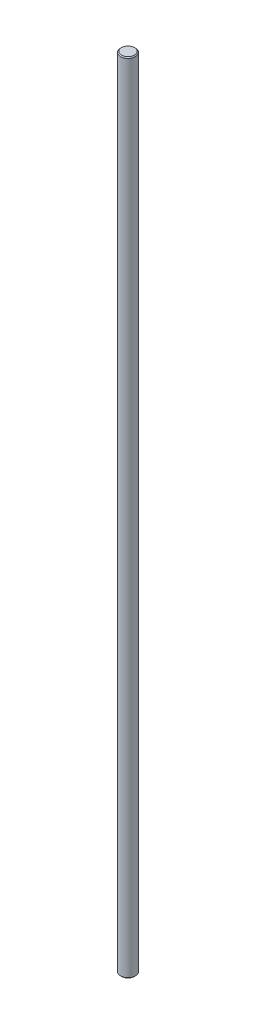
ISO-10303-21;
HEADER;
FILE_DESCRIPTION(('STEP AP214'),'2;1');
FILE_NAME('part.step','',(''),(''),'','','');
FILE_SCHEMA(('AUTOMOTIVE_DESIGN { 1 0 10303 214 1 1 1 1 }'));
ENDSEC;
DATA;
#1=APPLICATION_CONTEXT('core data for automotive mechanical design processes');
#2=APPLICATION_PROTOCOL_DEFINITION('international standard','automotive_design',2000,#1);
#3=PRODUCT_CONTEXT('',#1,'mechanical');
#4=PRODUCT('Part','Part','',(#3));
#5=PRODUCT_RELATED_PRODUCT_CATEGORY('part','',(#4));
#6=PRODUCT_DEFINITION_FORMATION('','',#4);
#7=PRODUCT_DEFINITION_CONTEXT('part definition',#1,'design');
#8=PRODUCT_DEFINITION('design','',#6,#7);
#9=PRODUCT_DEFINITION_SHAPE('','',#8);
#10=(LENGTH_UNIT() NAMED_UNIT(*) SI_UNIT(.MILLI.,.METRE.));
#11=(NAMED_UNIT(*) PLANE_ANGLE_UNIT() SI_UNIT($,.RADIAN.));
#12=(NAMED_UNIT(*) SI_UNIT($,.STERADIAN.) SOLID_ANGLE_UNIT());
#13=UNCERTAINTY_MEASURE_WITH_UNIT(LENGTH_MEASURE(1.E-05),#10,'distance_accuracy_value','');
#14=(GEOMETRIC_REPRESENTATION_CONTEXT(3) GLOBAL_UNCERTAINTY_ASSIGNED_CONTEXT((#13)) GLOBAL_UNIT_ASSIGNED_CONTEXT((#10,
#11,#12)) REPRESENTATION_CONTEXT('',''));
#15=CARTESIAN_POINT('',(0.,0.,0.));
#16=DIRECTION('',(0.,0.,1.));
#17=DIRECTION('',(1.,0.,0.));
#18=AXIS2_PLACEMENT_3D('',#15,#16,#17);
#19=CARTESIAN_POINT('',(0.,215.,0.));
#20=DIRECTION('',(0.,-1.,0.));
#21=DIRECTION('',(0.,0.,-1.));
#22=AXIS2_PLACEMENT_3D('',#19,#20,#21);
#23=CYLINDRICAL_SURFACE('',#22,4.);
#24=CARTESIAN_POINT('',(0.,-214.5,0.));
#25=DIRECTION('',(0.,1.,0.));
#26=DIRECTION('',(0.,0.,1.));
#27=AXIS2_PLACEMENT_3D('',#24,#25,#26);
#28=CIRCLE('',#27,4.);
#29=CARTESIAN_POINT('',(0.,-214.5,4.));
#30=VERTEX_POINT('',#29);
#31=EDGE_CURVE('E48',#30,#30,#28,.T.);
#32=ORIENTED_EDGE('',*,*,#31,.T.);
#33=EDGE_LOOP('',(#32));
#34=FACE_BOUND('',#33,.T.);
#35=CARTESIAN_POINT('',(0.,214.5,0.));
#36=DIRECTION('',(0.,1.,0.));
#37=DIRECTION('',(0.,0.,1.));
#38=AXIS2_PLACEMENT_3D('',#35,#36,#37);
#39=CIRCLE('',#38,4.);
#40=CARTESIAN_POINT('',(0.,214.5,4.));
#41=VERTEX_POINT('',#40);
#42=EDGE_CURVE('E52',#41,#41,#39,.F.);
#43=ORIENTED_EDGE('',*,*,#42,.T.);
#44=EDGE_LOOP('',(#43));
#45=FACE_BOUND('',#44,.T.);
#46=ADVANCED_FACE('F37',(#34,#45),#23,.T.);
#47=CARTESIAN_POINT('',(0.,215.,0.));
#48=DIRECTION('',(0.,1.,0.));
#49=DIRECTION('',(0.,0.,1.));
#50=AXIS2_PLACEMENT_3D('',#47,#48,#49);
#51=PLANE('',#50);
#52=CARTESIAN_POINT('',(0.,215.,0.));
#53=DIRECTION('',(0.,1.,0.));
#54=DIRECTION('',(0.,0.,1.));
#55=AXIS2_PLACEMENT_3D('',#52,#53,#54);
#56=CIRCLE('',#55,3.5);
#57=CARTESIAN_POINT('',(0.,215.,3.5));
#58=VERTEX_POINT('',#57);
#59=EDGE_CURVE('E10',#58,#58,#56,.T.);
#60=ORIENTED_EDGE('',*,*,#59,.T.);
#61=EDGE_LOOP('',(#60));
#62=FACE_BOUND('',#61,.T.);
#63=ADVANCED_FACE('F68',(#62),#51,.T.);
#64=CARTESIAN_POINT('',(0.,-215.,0.));
#65=DIRECTION('',(0.,1.,0.));
#66=DIRECTION('',(0.,0.,1.));
#67=AXIS2_PLACEMENT_3D('',#64,#65,#66);
#68=PLANE('',#67);
#69=CARTESIAN_POINT('',(0.,-215.,0.));
#70=DIRECTION('',(0.,1.,0.));
#71=DIRECTION('',(0.,0.,1.));
#72=AXIS2_PLACEMENT_3D('',#69,#70,#71);
#73=CIRCLE('',#72,3.5);
#74=CARTESIAN_POINT('',(0.,-215.,3.5));
#75=VERTEX_POINT('',#74);
#76=EDGE_CURVE('E44',#75,#75,#73,.F.);
#77=ORIENTED_EDGE('',*,*,#76,.T.);
#78=EDGE_LOOP('',(#77));
#79=FACE_BOUND('',#78,.T.);
#80=ADVANCED_FACE('F65',(#79),#68,.F.);
#81=CARTESIAN_POINT('',(0.,-214.5,0.));
#82=DIRECTION('',(0.,1.,0.));
#83=DIRECTION('',(0.,0.,1.));
#84=AXIS2_PLACEMENT_3D('',#81,#82,#83);
#85=CONICAL_SURFACE('',#84,4.,0.785398163397445);
#86=ORIENTED_EDGE('',*,*,#76,.F.);
#87=EDGE_LOOP('',(#86));
#88=FACE_BOUND('',#87,.T.);
#89=ORIENTED_EDGE('',*,*,#31,.F.);
#90=EDGE_LOOP('',(#89));
#91=FACE_BOUND('',#90,.T.);
#92=ADVANCED_FACE('F61',(#88,#91),#85,.T.);
#93=CARTESIAN_POINT('',(0.,215.,0.));
#94=DIRECTION('',(0.,-1.,0.));
#95=DIRECTION('',(0.,0.,-1.));
#96=AXIS2_PLACEMENT_3D('',#93,#94,#95);
#97=CONICAL_SURFACE('',#96,3.5,0.7853981633975);
#98=ORIENTED_EDGE('',*,*,#42,.F.);
#99=EDGE_LOOP('',(#98));
#100=FACE_BOUND('',#99,.T.);
#101=ORIENTED_EDGE('',*,*,#59,.F.);
#102=EDGE_LOOP('',(#101));
#103=FACE_BOUND('',#102,.T.);
#104=ADVANCED_FACE('F39',(#100,#103),#97,.T.);
#105=CLOSED_SHELL('',(#46,#63,#80,#92,#104));
#106=MANIFOLD_SOLID_BREP('B2',#105);
#107=ADVANCED_BREP_SHAPE_REPRESENTATION('',(#18,#106),#14);
#108=SHAPE_DEFINITION_REPRESENTATION(#9,#107);
ENDSEC;
END-ISO-10303-21;
